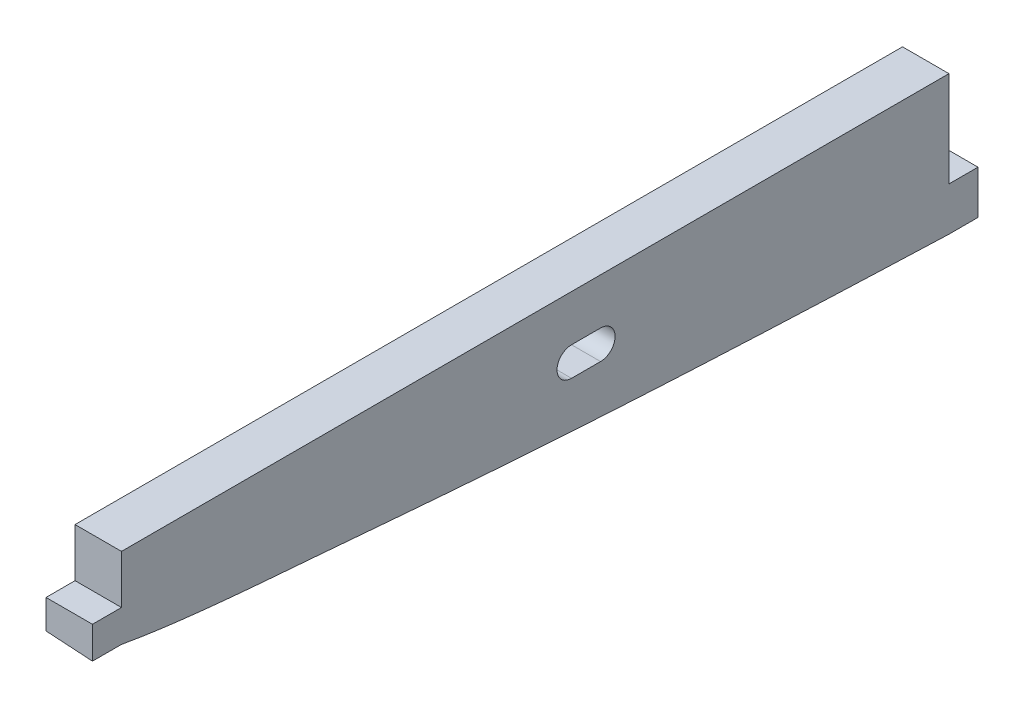
ISO-10303-21;
HEADER;
FILE_DESCRIPTION(('STEP AP214'),'2;1');
FILE_NAME('part.step','',(''),(''),'','','');
FILE_SCHEMA(('AUTOMOTIVE_DESIGN { 1 0 10303 214 1 1 1 1 }'));
ENDSEC;
DATA;
#1=APPLICATION_CONTEXT('core data for automotive mechanical design processes');
#2=APPLICATION_PROTOCOL_DEFINITION('international standard','automotive_design',2000,#1);
#3=PRODUCT_CONTEXT('',#1,'mechanical');
#4=PRODUCT('Part','Part','',(#3));
#5=PRODUCT_RELATED_PRODUCT_CATEGORY('part','',(#4));
#6=PRODUCT_DEFINITION_FORMATION('','',#4);
#7=PRODUCT_DEFINITION_CONTEXT('part definition',#1,'design');
#8=PRODUCT_DEFINITION('design','',#6,#7);
#9=PRODUCT_DEFINITION_SHAPE('','',#8);
#10=(LENGTH_UNIT() NAMED_UNIT(*) SI_UNIT(.MILLI.,.METRE.));
#11=(NAMED_UNIT(*) PLANE_ANGLE_UNIT() SI_UNIT($,.RADIAN.));
#12=(NAMED_UNIT(*) SI_UNIT($,.STERADIAN.) SOLID_ANGLE_UNIT());
#13=UNCERTAINTY_MEASURE_WITH_UNIT(LENGTH_MEASURE(1.E-05),#10,'distance_accuracy_value','');
#14=(GEOMETRIC_REPRESENTATION_CONTEXT(3) GLOBAL_UNCERTAINTY_ASSIGNED_CONTEXT((#13)) GLOBAL_UNIT_ASSIGNED_CONTEXT((#10,
#11,#12)) REPRESENTATION_CONTEXT('',''));
#15=CARTESIAN_POINT('',(0.,0.,0.));
#16=DIRECTION('',(0.,0.,1.));
#17=DIRECTION('',(1.,0.,0.));
#18=AXIS2_PLACEMENT_3D('',#15,#16,#17);
#19=CARTESIAN_POINT('',(0.,0.,12.7));
#20=DIRECTION('',(0.,1.,0.));
#21=DIRECTION('',(0.,0.,-1.));
#22=AXIS2_PLACEMENT_3D('',#19,#20,#21);
#23=PLANE('',#22);
#24=DIRECTION('',(0.,0.,1.));
#25=VECTOR('',#24,1.);
#26=CARTESIAN_POINT('',(5.08000000000002,0.,12.7));
#27=LINE('',#26,#25);
#28=CARTESIAN_POINT('',(5.08000000000002,0.,12.7));
#29=VERTEX_POINT('',#28);
#30=CARTESIAN_POINT('',(5.08000000000002,0.,193.675));
#31=VERTEX_POINT('',#30);
#32=EDGE_CURVE('E344',#29,#31,#27,.T.);
#33=ORIENTED_EDGE('',*,*,#32,.F.);
#34=DIRECTION('',(1.,0.,0.));
#35=VECTOR('',#34,1.);
#36=CARTESIAN_POINT('',(-5.07999999999998,0.,12.7));
#37=LINE('',#36,#35);
#38=CARTESIAN_POINT('',(-5.07999999999998,0.,12.7));
#39=VERTEX_POINT('',#38);
#40=EDGE_CURVE('E272',#39,#29,#37,.T.);
#41=ORIENTED_EDGE('',*,*,#40,.F.);
#42=DIRECTION('',(0.,0.,-1.));
#43=VECTOR('',#42,1.);
#44=CARTESIAN_POINT('',(-5.07999999999998,0.,193.675));
#45=LINE('',#44,#43);
#46=CARTESIAN_POINT('',(-5.07999999999998,0.,193.675));
#47=VERTEX_POINT('',#46);
#48=EDGE_CURVE('E351',#47,#39,#45,.T.);
#49=ORIENTED_EDGE('',*,*,#48,.F.);
#50=DIRECTION('',(-1.,0.,0.));
#51=VECTOR('',#50,1.);
#52=CARTESIAN_POINT('',(5.08000000000002,0.,193.675));
#53=LINE('',#52,#51);
#54=EDGE_CURVE('E347',#31,#47,#53,.T.);
#55=ORIENTED_EDGE('',*,*,#54,.F.);
#56=EDGE_LOOP('',(#33,#41,#49,#55));
#57=FACE_BOUND('',#56,.T.);
#58=ADVANCED_FACE('F36',(#57),#23,.T.);
#59=CARTESIAN_POINT('',(5.08000000000002,-42.6415296686,193.675));
#60=DIRECTION('',(0.,0.,1.));
#61=DIRECTION('',(-1.,0.,0.));
#62=AXIS2_PLACEMENT_3D('',#59,#60,#61);
#63=PLANE('',#62);
#64=DIRECTION('',(1.,0.,0.));
#65=VECTOR('',#64,1.);
#66=CARTESIAN_POINT('',(-5.08000000000006,-10.6301369254604,193.675));
#67=LINE('',#66,#65);
#68=CARTESIAN_POINT('',(-5.07999999999998,-10.6301369254604,193.675));
#69=VERTEX_POINT('',#68);
#70=CARTESIAN_POINT('',(5.08000000001965,-10.6301369254605,193.675));
#71=VERTEX_POINT('',#70);
#72=EDGE_CURVE('E312',#69,#71,#67,.T.);
#73=ORIENTED_EDGE('',*,*,#72,.T.);
#74=DIRECTION('',(0.,1.,0.));
#75=VECTOR('',#74,1.);
#76=CARTESIAN_POINT('',(5.08000000000002,-42.6415296686,193.675));
#77=LINE('',#76,#75);
#78=EDGE_CURVE('E269',#71,#31,#77,.T.);
#79=ORIENTED_EDGE('',*,*,#78,.T.);
#80=ORIENTED_EDGE('',*,*,#54,.T.);
#81=DIRECTION('',(0.,1.,0.));
#82=VECTOR('',#81,1.);
#83=CARTESIAN_POINT('',(-5.07999999999998,-42.6415296686,193.675));
#84=LINE('',#83,#82);
#85=EDGE_CURVE('E271',#69,#47,#84,.T.);
#86=ORIENTED_EDGE('',*,*,#85,.F.);
#87=EDGE_LOOP('',(#73,#79,#80,#86));
#88=FACE_BOUND('',#87,.T.);
#89=ADVANCED_FACE('F252',(#88),#63,.T.);
#90=CARTESIAN_POINT('',(-5.07999999999998,-42.6415296686,193.675));
#91=DIRECTION('',(-1.,0.,0.));
#92=DIRECTION('',(0.,0.,-1.));
#93=AXIS2_PLACEMENT_3D('',#90,#91,#92);
#94=PLANE('',#93);
#95=CARTESIAN_POINT('',(-5.07999999999998,-13.2559464874616,95.25));
#96=DIRECTION('',(1.,0.,0.));
#97=DIRECTION('',(0.,0.,-1.));
#98=AXIS2_PLACEMENT_3D('',#95,#96,#97);
#99=CIRCLE('',#98,3.175);
#100=CARTESIAN_POINT('',(-5.07999999999998,-16.4309464874616,95.25));
#101=VERTEX_POINT('',#100);
#102=CARTESIAN_POINT('',(-5.07999999999998,-10.0809464874616,95.25));
#103=VERTEX_POINT('',#102);
#104=EDGE_CURVE('E153',#101,#103,#99,.F.);
#105=ORIENTED_EDGE('',*,*,#104,.F.);
#106=DIRECTION('',(0.,0.,1.));
#107=VECTOR('',#106,1.);
#108=CARTESIAN_POINT('',(-5.07999999999998,-16.4309464874616,95.25));
#109=LINE('',#108,#107);
#110=CARTESIAN_POINT('',(-5.07999999999998,-16.4309464874615,88.9));
#111=VERTEX_POINT('',#110);
#112=EDGE_CURVE('E161',#111,#101,#109,.T.);
#113=ORIENTED_EDGE('',*,*,#112,.F.);
#114=CARTESIAN_POINT('',(-5.07999999999998,-13.2559464874616,88.9));
#115=DIRECTION('',(1.,0.,0.));
#116=DIRECTION('',(0.,0.,-1.));
#117=AXIS2_PLACEMENT_3D('',#114,#115,#116);
#118=CIRCLE('',#117,3.17499999999999);
#119=CARTESIAN_POINT('',(-5.07999999999998,-10.0809464874616,88.9));
#120=VERTEX_POINT('',#119);
#121=EDGE_CURVE('E154',#120,#111,#118,.F.);
#122=ORIENTED_EDGE('',*,*,#121,.F.);
#123=DIRECTION('',(0.,0.,-1.));
#124=VECTOR('',#123,1.);
#125=CARTESIAN_POINT('',(-5.07999999999998,-10.0809464874616,95.25));
#126=LINE('',#125,#124);
#127=EDGE_CURVE('E141',#103,#120,#126,.T.);
#128=ORIENTED_EDGE('',*,*,#127,.F.);
#129=EDGE_LOOP('',(#105,#113,#122,#128));
#130=FACE_BOUND('',#129,.T.);
#131=ORIENTED_EDGE('',*,*,#85,.T.);
#132=ORIENTED_EDGE('',*,*,#48,.T.);
#133=DIRECTION('',(0.,1.,0.));
#134=VECTOR('',#133,1.);
#135=CARTESIAN_POINT('',(-5.07999999999998,-42.6415296686,12.7));
#136=LINE('',#135,#134);
#137=CARTESIAN_POINT('',(-5.07999999999998,-20.8886194640954,12.7));
#138=VERTEX_POINT('',#137);
#139=EDGE_CURVE('E274',#138,#39,#136,.T.);
#140=ORIENTED_EDGE('',*,*,#139,.F.);
#141=DIRECTION('',(0.,0.,1.));
#142=VECTOR('',#141,1.);
#143=CARTESIAN_POINT('',(-5.07999999999998,-20.8886194640954,-8.45767184223761));
#144=LINE('',#143,#142);
#145=CARTESIAN_POINT('',(-5.07999999999998,-20.8886194640954,6.35));
#146=VERTEX_POINT('',#145);
#147=EDGE_CURVE('E289',#146,#138,#144,.T.);
#148=ORIENTED_EDGE('',*,*,#147,.F.);
#149=DIRECTION('',(0.,1.,0.));
#150=VECTOR('',#149,1.);
#151=CARTESIAN_POINT('',(-5.07999999999998,-20.8886194640954,6.35));
#152=LINE('',#151,#150);
#153=CARTESIAN_POINT('',(-5.07999999999998,-31.6608776018952,6.35));
#154=VERTEX_POINT('',#153);
#155=EDGE_CURVE('E180',#154,#146,#152,.T.);
#156=ORIENTED_EDGE('',*,*,#155,.F.);
#157=DIRECTION('',(0.,0.,1.));
#158=VECTOR('',#157,1.);
#159=CARTESIAN_POINT('',(-5.07999999999998,-31.6608776018952,-8.45767184223761));
#160=LINE('',#159,#158);
#161=CARTESIAN_POINT('',(-5.07999999999998,-31.6608776018952,12.7));
#162=VERTEX_POINT('',#161);
#163=EDGE_CURVE('E293',#154,#162,#160,.T.);
#164=ORIENTED_EDGE('',*,*,#163,.T.);
#165=CARTESIAN_POINT('',(-5.07999999999997,-16.980136925459,193.675));
#166=CARTESIAN_POINT('',(-5.07999999999998,-17.0756432841999,193.279641324373));
#167=CARTESIAN_POINT('',(-5.07999999999998,-17.1693085813412,192.883838602711));
#168=CARTESIAN_POINT('',(-5.07999999999998,-17.3530020275571,192.091392551927));
#169=CARTESIAN_POINT('',(-5.07999999999998,-17.4430301991864,191.694749228034));
#170=CARTESIAN_POINT('',(-5.07999999999998,-17.6194886808394,190.900695476805));
#171=CARTESIAN_POINT('',(-5.07999999999998,-17.7059192705462,190.503285111624));
#172=CARTESIAN_POINT('',(-5.07999999999998,-17.8752415454966,189.70771194313));
#173=CARTESIAN_POINT('',(-5.07999999999998,-17.9581332266649,189.309549138952));
#174=CARTESIAN_POINT('',(-5.07999999999998,-18.2014330247857,188.115812018219));
#175=CARTESIAN_POINT('',(-5.07999999999998,-18.3568577975812,187.319218300621));
#176=CARTESIAN_POINT('',(-5.07999999999998,-18.6558636111726,185.723805757226));
#177=CARTESIAN_POINT('',(-5.07999999999998,-18.7994443943849,184.924986883426));
#178=CARTESIAN_POINT('',(-5.07999999999998,-19.0759438392213,183.326404337825));
#179=CARTESIAN_POINT('',(-5.07999999999998,-19.208873921586,182.52664263705));
#180=CARTESIAN_POINT('',(-5.07999999999998,-19.4654406759777,180.925641403551));
#181=CARTESIAN_POINT('',(-5.07999999999998,-19.589077403171,180.124401879627));
#182=CARTESIAN_POINT('',(-5.07999999999998,-19.9476034577443,177.719551036883));
#183=CARTESIAN_POINT('',(-5.07999999999998,-20.1702276596377,176.114107508349));
#184=CARTESIAN_POINT('',(-5.07999999999998,-20.5900673405072,172.900116650782));
#185=CARTESIAN_POINT('',(-5.07999999999998,-20.7872853451357,171.291569646429));
#186=CARTESIAN_POINT('',(-5.07999999999998,-21.1620701204436,168.072124506418));
#187=CARTESIAN_POINT('',(-5.07999999999998,-21.3396359295028,166.461226259614));
#188=CARTESIAN_POINT('',(-5.07999999999998,-21.6794854929014,163.238776895735));
#189=CARTESIAN_POINT('',(-5.07999999999998,-21.8417780619349,161.627226701043));
#190=CARTESIAN_POINT('',(-5.07999999999998,-22.0764358088338,159.208865693673));
#191=CARTESIAN_POINT('',(-5.07999999999998,-22.1532000960466,158.402477343453));
#192=CARTESIAN_POINT('',(-5.07999999999998,-22.3041398392182,156.789458347721));
#193=CARTESIAN_POINT('',(-5.07999999999998,-22.3783152959955,155.982827702285));
#194=CARTESIAN_POINT('',(-5.07999999999998,-22.5244030857482,154.369193789618));
#195=CARTESIAN_POINT('',(-5.07999999999998,-22.5963149476835,153.562190479828));
#196=CARTESIAN_POINT('',(-5.07999999999998,-22.7381464018302,151.948008974779));
#197=CARTESIAN_POINT('',(-5.07999999999998,-22.8080659935863,151.140830779478));
#198=CARTESIAN_POINT('',(-5.07999999999998,-22.9466155112933,149.526244722052));
#199=CARTESIAN_POINT('',(-5.07999999999998,-23.0152452463667,148.718836843605));
#200=CARTESIAN_POINT('',(-5.07999999999998,-23.151750342573,147.103957471898));
#201=CARTESIAN_POINT('',(-5.07999999999998,-23.2196257037258,146.296485978638));
#202=CARTESIAN_POINT('',(-5.07999999999998,-23.3550678473177,144.681465051655));
#203=CARTESIAN_POINT('',(-5.07999999999998,-23.4226346097008,143.873915616253));
#204=CARTESIAN_POINT('',(-5.07999999999998,-23.5577979145751,142.258819307691));
#205=CARTESIAN_POINT('',(-5.07999999999998,-23.6253944570635,141.451272434532));
#206=CARTESIAN_POINT('',(-5.07999999999998,-23.7608885714423,139.836221314754));
#207=CARTESIAN_POINT('',(-5.07999999999999,-23.8287861368574,139.028717067593));
#208=CARTESIAN_POINT('',(-5.07999999999998,-23.9650469993956,137.413747846051));
#209=CARTESIAN_POINT('',(-5.07999999999996,-24.0334102965385,136.606282871673));
#210=CARTESIAN_POINT('',(-5.07999999999995,-24.2104094955639,134.518940509737));
#211=CARTESIAN_POINT('',(-5.07999999999997,-24.319205863186,133.239076745608));
#212=CARTESIAN_POINT('',(-5.07999999999999,-24.5365927351079,130.679331771097));
#213=CARTESIAN_POINT('',(-5.07999999999998,-24.645183239404,129.399450560714));
#214=CARTESIAN_POINT('',(-5.07999999999998,-24.9696766478191,125.560019069695));
#215=CARTESIAN_POINT('',(-5.07999999999998,-25.1843287875946,123.000362386711));
#216=CARTESIAN_POINT('',(-5.07999999999998,-25.6068418525892,117.880670391001));
#217=CARTESIAN_POINT('',(-5.07999999999998,-25.8147032621842,115.320635118422));
#218=CARTESIAN_POINT('',(-5.07999999999998,-26.2216446216809,110.199891995452));
#219=CARTESIAN_POINT('',(-5.07999999999998,-26.420724663544,107.639184152389));
#220=CARTESIAN_POINT('',(-5.07999999999998,-26.8090574176331,102.516393462246));
#221=CARTESIAN_POINT('',(-5.07999999999998,-26.9983077178674,99.9543104320919));
#222=CARTESIAN_POINT('',(-5.07999999999998,-27.3664831960342,94.8292800923983));
#223=CARTESIAN_POINT('',(-5.07999999999999,-27.5454078834583,92.2663327476081));
#224=CARTESIAN_POINT('',(-5.07999999999997,-27.8929011409521,87.1396729527292));
#225=CARTESIAN_POINT('',(-5.07999999999996,-28.0614694561491,84.5759604853696));
#226=CARTESIAN_POINT('',(-5.08,-28.3885126736673,79.4478890788395));
#227=CARTESIAN_POINT('',(-5.08000000000006,-28.5469875632486,76.8835301388569));
#228=CARTESIAN_POINT('',(-5.08000000000006,-28.8543839446516,71.7525143894621));
#229=CARTESIAN_POINT('',(-5.08,-29.0032989581331,69.1858571923681));
#230=CARTESIAN_POINT('',(-5.07999999999996,-29.2920784438324,64.0520724929954));
#231=CARTESIAN_POINT('',(-5.07999999999997,-29.4319430491782,61.4849449981918));
#232=CARTESIAN_POINT('',(-5.07999999999998,-29.7034974721747,56.3502743410809));
#233=CARTESIAN_POINT('',(-5.07999999999998,-29.8351873397007,53.7827311814055));
#234=CARTESIAN_POINT('',(-5.07999999999998,-30.0912535213796,48.6472826502346));
#235=CARTESIAN_POINT('',(-5.07999999999998,-30.2156298402283,46.0793772789727));
#236=CARTESIAN_POINT('',(-5.07999999999998,-30.4578826901643,40.9441948350664));
#237=CARTESIAN_POINT('',(-5.07999999999998,-30.5757615640939,38.3769178726829));
#238=CARTESIAN_POINT('',(-5.07999999999998,-30.8058934885533,33.2421051413394));
#239=CARTESIAN_POINT('',(-5.07999999999998,-30.9181465232957,30.6745693716734));
#240=CARTESIAN_POINT('',(-5.07999999999998,-31.1378156049216,25.5392878959896));
#241=CARTESIAN_POINT('',(-5.07999999999998,-31.2452316449257,22.9715421896785));
#242=CARTESIAN_POINT('',(-5.07999999999998,-31.4559544814913,17.8358862061857));
#243=CARTESIAN_POINT('',(-5.07999999999997,-31.5592612848125,15.2679759292818));
#244=CARTESIAN_POINT('',(-5.07999999999997,-31.6608776018952,12.7));
#245=B_SPLINE_CURVE_WITH_KNOTS('',3,(#165,#166,#167,#168,#169,#170,#171,#172,#173,#174,#175,
#176,#177,#178,#179,#180,#181,#182,#183,#184,#185,#186,#187,#188,#189,#190,#191,#192,#193,#194,
#195,#196,#197,#198,#199,#200,#201,#202,#203,#204,#205,#206,#207,#208,#209,#210,#211,#212,#213,
#214,#215,#216,#217,#218,#219,#220,#221,#222,#223,#224,#225,#226,#227,#228,#229,#230,#231,#232,
#233,#234,#235,#236,#237,#238,#239,#240,#241,#242,#243,#244),.UNSPECIFIED.,.F.,.F.,(4,2,2,2,2,2,
2,2,2,2,2,2,2,2,2,2,2,2,2,2,2,2,2,2,2,2,2,2,2,2,2,2,2,2,2,2,2,2,2,4),(0.,1.22018694247771,
2.44036631710815,3.66045065476075,4.88053639743518,7.31526797891859,9.75005249711785,
12.1821902481035,14.6143135605178,19.4764306817586,24.3380640820521,29.1999352664489,
34.0589830711703,36.4890816304299,38.9191794213091,41.3497796016219,43.7803803373277,
46.2113379737972,48.6422955460615,51.0734089221001,53.5045220747313,55.9355831846378,
58.3666443981318,62.2200832218083,66.073522111523,73.7794407503376,81.4848085282798,
89.1900955938608,96.8972645125357,104.604799251938,112.312523599625,120.020257675914,
127.73316100456,135.445950853657,143.158693641286,150.871431476734,158.581369819146,
166.291329796186,174.00130073802,181.711258996097),.UNSPECIFIED.);
#246=CARTESIAN_POINT('',(-5.07999999999998,-16.980136925459,193.675));
#247=VERTEX_POINT('',#246);
#248=EDGE_CURVE('E227',#247,#162,#245,.T.);
#249=ORIENTED_EDGE('',*,*,#248,.F.);
#250=DIRECTION('',(0.,0.,-1.));
#251=VECTOR('',#250,1.);
#252=CARTESIAN_POINT('',(-5.08000000000011,-16.9801369254604,212.360092337899));
#253=LINE('',#252,#251);
#254=CARTESIAN_POINT('',(-5.08000000000011,-16.9801369254604,200.025));
#255=VERTEX_POINT('',#254);
#256=EDGE_CURVE('E316',#255,#247,#253,.T.);
#257=ORIENTED_EDGE('',*,*,#256,.F.);
#258=DIRECTION('',(0.,1.,0.));
#259=VECTOR('',#258,1.);
#260=CARTESIAN_POINT('',(-5.08000000000011,-16.9801369254604,200.025));
#261=LINE('',#260,#259);
#262=CARTESIAN_POINT('',(-5.08000000000006,-10.6301369254604,200.025));
#263=VERTEX_POINT('',#262);
#264=EDGE_CURVE('E331',#255,#263,#261,.T.);
#265=ORIENTED_EDGE('',*,*,#264,.T.);
#266=DIRECTION('',(0.,0.,-1.));
#267=VECTOR('',#266,1.);
#268=CARTESIAN_POINT('',(-5.08000000000006,-10.6301369254604,212.360092337899));
#269=LINE('',#268,#267);
#270=EDGE_CURVE('E314',#263,#69,#269,.T.);
#271=ORIENTED_EDGE('',*,*,#270,.T.);
#272=EDGE_LOOP('',(#131,#132,#140,#148,#156,#164,#249,#257,#265,#271));
#273=FACE_BOUND('',#272,.T.);
#274=ADVANCED_FACE('F150',(#130,#273),#94,.T.);
#275=CARTESIAN_POINT('',(-5.07999999999998,-42.6415296686,12.7));
#276=DIRECTION('',(0.,0.,-1.));
#277=DIRECTION('',(1.,0.,0.));
#278=AXIS2_PLACEMENT_3D('',#275,#276,#277);
#279=PLANE('',#278);
#280=DIRECTION('',(-1.,0.,0.));
#281=VECTOR('',#280,1.);
#282=CARTESIAN_POINT('',(5.08000000000001,-20.8886194640954,12.7));
#283=LINE('',#282,#281);
#284=CARTESIAN_POINT('',(5.08000000000002,-20.8886194640954,12.7));
#285=VERTEX_POINT('',#284);
#286=EDGE_CURVE('E155',#285,#138,#283,.T.);
#287=ORIENTED_EDGE('',*,*,#286,.T.);
#288=ORIENTED_EDGE('',*,*,#139,.T.);
#289=ORIENTED_EDGE('',*,*,#40,.T.);
#290=DIRECTION('',(0.,1.,0.));
#291=VECTOR('',#290,1.);
#292=CARTESIAN_POINT('',(5.08000000000002,-42.6415296686,12.7));
#293=LINE('',#292,#291);
#294=EDGE_CURVE('E46',#285,#29,#293,.T.);
#295=ORIENTED_EDGE('',*,*,#294,.F.);
#296=EDGE_LOOP('',(#287,#288,#289,#295));
#297=FACE_BOUND('',#296,.T.);
#298=ADVANCED_FACE('F251',(#297),#279,.T.);
#299=CARTESIAN_POINT('',(5.08000000000002,-42.6415296686,12.7));
#300=DIRECTION('',(1.,0.,0.));
#301=DIRECTION('',(0.,0.,1.));
#302=AXIS2_PLACEMENT_3D('',#299,#300,#301);
#303=PLANE('',#302);
#304=CARTESIAN_POINT('',(5.08000000000002,-13.2559464874616,95.25));
#305=DIRECTION('',(-1.,0.,0.));
#306=DIRECTION('',(0.,0.,1.));
#307=AXIS2_PLACEMENT_3D('',#304,#305,#306);
#308=CIRCLE('',#307,3.175);
#309=CARTESIAN_POINT('',(5.08000000000002,-16.4309464874616,95.25));
#310=VERTEX_POINT('',#309);
#311=CARTESIAN_POINT('',(5.08000000000002,-10.0809464874616,95.25));
#312=VERTEX_POINT('',#311);
#313=EDGE_CURVE('E160',#310,#312,#308,.T.);
#314=ORIENTED_EDGE('',*,*,#313,.T.);
#315=DIRECTION('',(0.,0.,-1.));
#316=VECTOR('',#315,1.);
#317=CARTESIAN_POINT('',(5.08000000000002,-10.0809464874616,95.25));
#318=LINE('',#317,#316);
#319=CARTESIAN_POINT('',(5.08000000000002,-10.0809464874616,88.9));
#320=VERTEX_POINT('',#319);
#321=EDGE_CURVE('E144',#312,#320,#318,.T.);
#322=ORIENTED_EDGE('',*,*,#321,.T.);
#323=CARTESIAN_POINT('',(5.08000000000002,-13.2559464874616,88.9));
#324=DIRECTION('',(-1.,0.,0.));
#325=DIRECTION('',(0.,0.,1.));
#326=AXIS2_PLACEMENT_3D('',#323,#324,#325);
#327=CIRCLE('',#326,3.17499999999999);
#328=CARTESIAN_POINT('',(5.08000000000002,-16.4309464874615,88.9));
#329=VERTEX_POINT('',#328);
#330=EDGE_CURVE('E168',#320,#329,#327,.T.);
#331=ORIENTED_EDGE('',*,*,#330,.T.);
#332=DIRECTION('',(0.,0.,1.));
#333=VECTOR('',#332,1.);
#334=CARTESIAN_POINT('',(5.08000000000002,-16.4309464874616,95.25));
#335=LINE('',#334,#333);
#336=EDGE_CURVE('E146',#329,#310,#335,.T.);
#337=ORIENTED_EDGE('',*,*,#336,.T.);
#338=EDGE_LOOP('',(#314,#322,#331,#337));
#339=FACE_BOUND('',#338,.T.);
#340=ORIENTED_EDGE('',*,*,#294,.T.);
#341=ORIENTED_EDGE('',*,*,#32,.T.);
#342=ORIENTED_EDGE('',*,*,#78,.F.);
#343=DIRECTION('',(0.,0.,-1.));
#344=VECTOR('',#343,1.);
#345=CARTESIAN_POINT('',(5.08000000001965,-10.6301369254605,212.360092337899));
#346=LINE('',#345,#344);
#347=CARTESIAN_POINT('',(5.08000000001965,-10.6301369254605,200.025));
#348=VERTEX_POINT('',#347);
#349=EDGE_CURVE('E275',#348,#71,#346,.T.);
#350=ORIENTED_EDGE('',*,*,#349,.F.);
#351=DIRECTION('',(1.84621829690683E-12,-1.,0.));
#352=VECTOR('',#351,1.);
#353=CARTESIAN_POINT('',(5.08000000001965,-10.6301369254605,200.025));
#354=LINE('',#353,#352);
#355=CARTESIAN_POINT('',(5.08000000003256,-17.625056723702,200.025));
#356=VERTEX_POINT('',#355);
#357=EDGE_CURVE('E325',#348,#356,#354,.T.);
#358=ORIENTED_EDGE('',*,*,#357,.T.);
#359=DIRECTION('',(0.,0.,-1.));
#360=VECTOR('',#359,1.);
#361=CARTESIAN_POINT('',(5.08000000003256,-17.625056723702,212.360092337899));
#362=LINE('',#361,#360);
#363=CARTESIAN_POINT('',(5.08000000003256,-17.625056723702,193.675));
#364=VERTEX_POINT('',#363);
#365=EDGE_CURVE('E187',#356,#364,#362,.T.);
#366=ORIENTED_EDGE('',*,*,#365,.T.);
#367=CARTESIAN_POINT('',(5.08000000000001,-30.4136194640954,12.7));
#368=CARTESIAN_POINT('',(5.08000000000002,-30.3607103436633,14.1380393395333));
#369=CARTESIAN_POINT('',(5.08000000000002,-30.3073974421912,15.5760638092187));
#370=CARTESIAN_POINT('',(5.08000000000002,-30.1998879656296,18.4520798784456));
#371=CARTESIAN_POINT('',(5.08000000000002,-30.1456913904354,19.8900714779833));
#372=CARTESIAN_POINT('',(5.08000000000002,-29.9816607154129,24.2040257032686));
#373=CARTESIAN_POINT('',(5.08000000000002,-29.8703869112998,27.0799338152813));
#374=CARTESIAN_POINT('',(5.08000000000002,-29.643153880169,32.8315800473151));
#375=CARTESIAN_POINT('',(5.08000000000002,-29.5271946293481,35.7073181663982));
#376=CARTESIAN_POINT('',(5.08000000000002,-29.2894321698031,41.4585535165029));
#377=CARTESIAN_POINT('',(5.08000000000002,-29.1676289613124,44.334050747534));
#378=CARTESIAN_POINT('',(5.08000000000002,-28.9169973843641,50.0850216649859));
#379=CARTESIAN_POINT('',(5.08000000000002,-28.7881683302458,52.9604953216201));
#380=CARTESIAN_POINT('',(5.08000000000002,-28.5222513377042,58.7110548423074));
#381=CARTESIAN_POINT('',(5.08000000000002,-28.3851634196582,61.5861407073));
#382=CARTESIAN_POINT('',(5.08000000000002,-28.1014312147161,67.3358458145818));
#383=CARTESIAN_POINT('',(5.08000000000003,-27.9547869162825,70.2104650563035));
#384=CARTESIAN_POINT('',(5.08000000000002,-27.6506446639058,75.9591578313104));
#385=CARTESIAN_POINT('',(5.08,-27.4931466082859,78.8332313592305));
#386=CARTESIAN_POINT('',(5.08,-27.1522154157379,84.8229853570577));
#387=CARTESIAN_POINT('',(5.08000000000002,-26.9677152185729,87.9386052912551));
#388=CARTESIAN_POINT('',(5.08000000000003,-26.5833815188076,94.1688790915734));
#389=CARTESIAN_POINT('',(5.08000000000002,-26.3835481211627,97.2835329641604));
#390=CARTESIAN_POINT('',(5.08000000000002,-25.968013076623,103.511688476695));
#391=CARTESIAN_POINT('',(5.08000000000002,-25.7523119057466,106.625190148393));
#392=CARTESIAN_POINT('',(5.08000000000002,-25.3051846626412,112.850872357938));
#393=CARTESIAN_POINT('',(5.08000000000002,-25.0737595538228,115.96305296499));
#394=CARTESIAN_POINT('',(5.08000000000002,-24.7158863962705,120.630523602852));
#395=CARTESIAN_POINT('',(5.08000000000002,-24.5948049605019,122.186227720433));
#396=CARTESIAN_POINT('',(5.08000000000002,-24.3494318736625,125.297382805915));
#397=CARTESIAN_POINT('',(5.08000000000002,-24.2251402227382,126.852833773828));
#398=CARTESIAN_POINT('',(5.08000000000002,-23.9738349400709,129.963600419338));
#399=CARTESIAN_POINT('',(5.08000000000003,-23.8468211608,131.518916084993));
#400=CARTESIAN_POINT('',(5.08000000000002,-23.5907791618374,134.629381404909));
#401=CARTESIAN_POINT('',(5.08,-23.4617509419614,136.184531059156));
#402=CARTESIAN_POINT('',(5.08,-23.2024882619735,139.296399789814));
#403=CARTESIAN_POINT('',(5.08000000000002,-23.0722526620826,140.853118770995));
#404=CARTESIAN_POINT('',(5.08000000000002,-22.8770602254366,143.188213447373));
#405=CARTESIAN_POINT('',(5.08000000000002,-22.8120227933639,143.966582403));
#406=CARTESIAN_POINT('',(5.08000000000002,-22.6822054359759,145.523341804854));
#407=CARTESIAN_POINT('',(5.08000000000002,-22.6174255106606,146.301732251081));
#408=CARTESIAN_POINT('',(5.08000000000002,-22.4883423312408,147.858535740854));
#409=CARTESIAN_POINT('',(5.08000000000002,-22.4240390668281,148.636948783544));
#410=CARTESIAN_POINT('',(5.08000000000002,-22.2961936786966,150.193837331513));
#411=CARTESIAN_POINT('',(5.08000000000002,-22.2326515549225,150.972312836788));
#412=CARTESIAN_POINT('',(5.08000000000002,-22.1061326809115,152.52927392166));
#413=CARTESIAN_POINT('',(5.08000000000002,-22.0431559049875,153.307759499173));
#414=CARTESIAN_POINT('',(5.08000000000002,-21.9174469869299,154.864750492744));
#415=CARTESIAN_POINT('',(5.08000000000002,-21.8547148448349,155.643255908805));
#416=CARTESIAN_POINT('',(5.08000000000002,-21.7290996088921,157.20019725001));
#417=CARTESIAN_POINT('',(5.08000000000002,-21.6662165264276,157.978633176071));
#418=CARTESIAN_POINT('',(5.08000000000002,-21.5397874952247,159.535451324608));
#419=CARTESIAN_POINT('',(5.08000000000002,-21.4762415464973,160.313833547085));
#420=CARTESIAN_POINT('',(5.08000000000002,-21.347847152608,161.870416149521));
#421=CARTESIAN_POINT('',(5.08000000000002,-21.2829988324972,162.648616539747));
#422=CARTESIAN_POINT('',(5.08000000000002,-21.1512518242833,164.204843945406));
#423=CARTESIAN_POINT('',(5.08000000000002,-21.0843531365969,164.982870960872));
#424=CARTESIAN_POINT('',(5.08000000000002,-20.9482146762939,166.538928192035));
#425=CARTESIAN_POINT('',(5.08000000000002,-20.8789742886037,167.316958354051));
#426=CARTESIAN_POINT('',(5.08000000000002,-20.7378146298909,168.872775395504));
#427=CARTESIAN_POINT('',(5.08000000000002,-20.665895358104,169.650562274872));
#428=CARTESIAN_POINT('',(5.08000000000003,-20.4455592276707,171.983396583078));
#429=CARTESIAN_POINT('',(5.08000000000004,-20.2925554972749,173.538016579228));
#430=CARTESIAN_POINT('',(5.08,-19.9704907744767,176.645591394602));
#431=CARTESIAN_POINT('',(5.07999999999994,-19.8014298953118,178.19854622549));
#432=CARTESIAN_POINT('',(5.08000000000011,-19.4422453062202,181.302258404441));
#433=CARTESIAN_POINT('',(5.08000000000034,-19.2521189133328,182.853015447055));
#434=CARTESIAN_POINT('',(5.07999999999986,-18.9462553908146,185.176767804522));
#435=CARTESIAN_POINT('',(5.07999999999956,-18.8408301211286,185.951122393865));
#436=CARTESIAN_POINT('',(5.08000000000048,-18.6221096928751,187.498713262901));
#437=CARTESIAN_POINT('',(5.0800000000017,-18.5088146354207,188.271949556831));
#438=CARTESIAN_POINT('',(5.07999999999834,-18.2731708809179,189.817816326486));
#439=CARTESIAN_POINT('',(5.07999999999376,-18.1508134996291,190.590445484929));
#440=CARTESIAN_POINT('',(5.08000000000628,-17.8958962557515,192.134052334315));
#441=CARTESIAN_POINT('',(5.08000000002339,-17.7633359268146,192.905029948113));
#442=CARTESIAN_POINT('',(5.08000000006509,-17.6250567237026,193.675));
#443=B_SPLINE_CURVE_WITH_KNOTS('',3,(#367,#368,#369,#370,#371,#372,#373,#374,#375,#376,#377,
#378,#379,#380,#381,#382,#383,#384,#385,#386,#387,#388,#389,#390,#391,#392,#393,#394,#395,#396,
#397,#398,#399,#400,#401,#402,#403,#404,#405,#406,#407,#408,#409,#410,#411,#412,#413,#414,#415,
#416,#417,#418,#419,#420,#421,#422,#423,#424,#425,#426,#427,#428,#429,#430,#431,#432,#433,#434,
#435,#436,#437,#438,#439,#440,#441,#442),.UNSPECIFIED.,.F.,.F.,(4,2,2,2,2,2,2,2,2,2,2,2,2,2,2,2,
2,2,2,2,2,2,2,2,2,2,2,2,2,2,2,2,2,2,2,2,2,4),(0.,4.31703691222627,8.63407433592854,
17.2682510729776,25.9024716792377,34.536691940514,43.1717563387558,51.8067994322281,
60.4418529510671,69.0769873731256,78.4401853752597,87.8033192922918,97.1661724384823,
106.528452436058,111.209676412762,115.890900175587,120.572378285761,125.253856824221,
129.94032857947,132.28357266191,134.626816744655,136.970010003471,139.31320309232,
141.656289172387,143.999375623261,146.342290596994,148.685205532057,151.027896570597,
153.370587133108,155.713897882687,158.057209300724,162.743534343582,167.429826340207,
172.116715883239,174.461177735905,176.805609471884,179.152317644566,181.49913314243),.UNSPECIFIED.);
#444=CARTESIAN_POINT('',(5.08000000000002,-30.4136194640954,12.7));
#445=VERTEX_POINT('',#444);
#446=EDGE_CURVE('E238',#445,#364,#443,.T.);
#447=ORIENTED_EDGE('',*,*,#446,.F.);
#448=DIRECTION('',(0.,0.,1.));
#449=VECTOR('',#448,1.);
#450=CARTESIAN_POINT('',(5.07999999999997,-30.4136194640954,-8.45767184223761));
#451=LINE('',#450,#449);
#452=CARTESIAN_POINT('',(5.07999999999997,-30.4136194640954,6.35));
#453=VERTEX_POINT('',#452);
#454=EDGE_CURVE('E296',#453,#445,#451,.T.);
#455=ORIENTED_EDGE('',*,*,#454,.F.);
#456=DIRECTION('',(0.,-1.,0.));
#457=VECTOR('',#456,1.);
#458=CARTESIAN_POINT('',(5.07999999999997,-30.4136194640954,6.35));
#459=LINE('',#458,#457);
#460=CARTESIAN_POINT('',(5.08000000000001,-20.8886194640954,6.35));
#461=VERTEX_POINT('',#460);
#462=EDGE_CURVE('E179',#461,#453,#459,.T.);
#463=ORIENTED_EDGE('',*,*,#462,.F.);
#464=DIRECTION('',(0.,0.,1.));
#465=VECTOR('',#464,1.);
#466=CARTESIAN_POINT('',(5.08,-20.8886194640954,-8.45767184223761));
#467=LINE('',#466,#465);
#468=EDGE_CURVE('E292',#461,#285,#467,.T.);
#469=ORIENTED_EDGE('',*,*,#468,.T.);
#470=EDGE_LOOP('',(#340,#341,#342,#350,#358,#366,#447,#455,#463,#469));
#471=FACE_BOUND('',#470,.T.);
#472=ADVANCED_FACE('F38',(#339,#471),#303,.T.);
#473=CARTESIAN_POINT('',(431.734840310151,21.7605937801039,12.7));
#474=CARTESIAN_POINT('',(354.767844288554,16.8338696421729,193.675));
#475=CARTESIAN_POINT('',(359.947038365062,12.3559912931068,12.7));
#476=CARTESIAN_POINT('',(310.097450923152,11.6348174747197,193.675));
#477=CARTESIAN_POINT('',(269.243100308333,4.47194242178666,12.7));
#478=CARTESIAN_POINT('',(262.811763272532,6.19328661899001,193.675));
#479=CARTESIAN_POINT('',(134.824681561379,-11.5965261113863,12.7));
#480=CARTESIAN_POINT('',(174.807204775536,-3.12370601781253,193.675));
#481=CARTESIAN_POINT('',(61.0079838057599,-23.2707663222177,12.7));
#482=CARTESIAN_POINT('',(125.885137964367,-8.40143482766446,193.675));
#483=CARTESIAN_POINT('',(-7.57448013019039,-32.0728085231161,12.7));
#484=CARTESIAN_POINT('',(95.2392830186844,-12.5543427594087,193.675));
#485=CARTESIAN_POINT('',(-56.6014415598715,-37.4273851616648,12.7));
#486=CARTESIAN_POINT('',(73.2328383306058,-14.545039815151,193.675));
#487=CARTESIAN_POINT('',(-101.554682383788,-40.6255245092423,12.7));
#488=CARTESIAN_POINT('',(53.19290947036,-15.6229185194115,193.675));
#489=CARTESIAN_POINT('',(-162.108512633066,-42.6405296686,12.7));
#490=CARTESIAN_POINT('',(26.4224711708667,-17.7841951964629,193.675));
#491=CARTESIAN_POINT('',(-219.674755662316,-42.1913696879014,12.7));
#492=CARTESIAN_POINT('',(1.20435486937876,-18.3278371209846,193.675));
#493=CARTESIAN_POINT('',(-277.387002198729,-37.6824386266616,12.7));
#494=CARTESIAN_POINT('',(-24.762319926496,-14.6646457914026,193.675));
#495=CARTESIAN_POINT('',(-316.91598283312,-32.429184881224,12.7));
#496=CARTESIAN_POINT('',(-42.8978776568357,-11.2117215138955,193.675));
#497=CARTESIAN_POINT('',(-335.873433041802,-29.2217461076087,12.7));
#498=CARTESIAN_POINT('',(-51.7668614896513,-9.28862358966858,193.675));
#499=CARTESIAN_POINT('',(-355.917706008495,-24.6769147105371,12.7));
#500=CARTESIAN_POINT('',(-61.3592087829487,-7.08085040375625,193.675));
#501=CARTESIAN_POINT('',(-376.479719065935,-18.4843074578187,12.7));
#502=CARTESIAN_POINT('',(-71.4229154101156,-4.47533013950984,193.675));
#503=CARTESIAN_POINT('',(-403.619324126275,-5.76674386113685,12.7));
#504=CARTESIAN_POINT('',(-84.7809802121899,2.46786226068882,193.675));
#505=CARTESIAN_POINT('',(-419.319297489577,5.54724659797443,12.7));
#506=CARTESIAN_POINT('',(-92.8925549799078,8.60514732719381,193.675));
#507=CARTESIAN_POINT('',(-426.587707478516,12.2355937801035,12.7));
#508=CARTESIAN_POINT('',(-96.6320286366427,12.2355937801034,193.675));
#509=B_SPLINE_SURFACE_WITH_KNOTS('',3,1,((#473,#474),(#475,#476),(#477,#478),(#479,#480),(#481,
#482),(#483,#484),(#485,#486),(#487,#488),(#489,#490),(#491,#492),(#493,#494),(#495,#496),(#497,
#498),(#499,#500),(#501,#502),(#503,#504),(#505,#506),(#507,#508)),.UNSPECIFIED.,.F.,.F.,.F.,(4,
1,1,1,1,1,1,1,1,1,1,1,1,1,1,4),(2,2),(0.,0.247403676163197,0.308401542794999,0.462108507234246,
0.504395117820794,0.542913331738732,0.627983171442133,0.653401948280027,0.743134379497065,
0.818760812058344,0.850169972641487,0.882434425471212,0.887176210845698,0.924179621726545,
0.960505119713505,1.),(0.,1.),.UNSPECIFIED.);
#510=CARTESIAN_POINT('',(5.08000000000003,-17.6250567237014,193.675));
#511=CARTESIAN_POINT('',(4.65604426083976,-17.6084136688874,193.675));
#512=CARTESIAN_POINT('',(4.23213671133665,-17.5905356848612,193.675));
#513=CARTESIAN_POINT('',(3.38448194754094,-17.5522689980007,193.675));
#514=CARTESIAN_POINT('',(2.96073472070473,-17.531880572917,193.675));
#515=CARTESIAN_POINT('',(2.11340264561636,-17.4885501104286,193.675));
#516=CARTESIAN_POINT('',(1.68981778755865,-17.4656082649375,193.675));
#517=CARTESIAN_POINT('',(0.842812448115538,-17.4171319014567,193.675));
#518=CARTESIAN_POINT('',(0.419391961113545,-17.3915974816673,193.675));
#519=CARTESIAN_POINT('',(-0.427281511848075,-17.3378839877552,193.675));
#520=CARTESIAN_POINT('',(-0.850534497723835,-17.30970491231,193.675));
#521=CARTESIAN_POINT('',(-1.69687264729717,-17.2507127904831,193.675));
#522=CARTESIAN_POINT('',(-2.11995780414094,-17.2198996458253,193.675));
#523=CARTESIAN_POINT('',(-2.96596574211308,-17.1557137528854,193.675));
#524=CARTESIAN_POINT('',(-3.38888850862457,-17.122340812141,193.675));
#525=CARTESIAN_POINT('',(-4.23457656645487,-17.0530964507859,193.675));
#526=CARTESIAN_POINT('',(-4.65734183520719,-17.0172247544861,193.675));
#527=CARTESIAN_POINT('',(-5.07999999999997,-16.980136925459,193.675));
#528=B_SPLINE_CURVE_WITH_KNOTS('',3,(#510,#511,#512,#513,#514,#515,#516,#517,#518,#519,#520,
#521,#522,#523,#524,#525,#526,#527),.UNSPECIFIED.,.F.,.F.,(4,2,2,2,2,2,2,2,4),(0.,
1.27284549321829,2.54555028752222,3.81815949055707,5.09072050827215,6.36328216235195,
7.63589131604013,8.90859624688347,10.1814418190823),.UNSPECIFIED.);
#529=EDGE_CURVE('E11',#364,#247,#528,.T.);
#530=CARTESIAN_POINT('',(-5.07999999999997,-31.6608776018952,12.7));
#531=CARTESIAN_POINT('',(-4.51538226191388,-31.5930016782029,12.7));
#532=CARTESIAN_POINT('',(-3.95079389377193,-31.524881508298,12.7));
#533=CARTESIAN_POINT('',(-2.82167608878542,-31.3881609554358,12.7));
#534=CARTESIAN_POINT('',(-2.25714665186112,-31.3195605731369,12.7));
#535=CARTESIAN_POINT('',(-1.12814572484586,-31.1818877340982,12.7));
#536=CARTESIAN_POINT('',(-0.563674234716949,-31.1128152776697,12.7));
#537=CARTESIAN_POINT('',(0.565211766645643,-30.9742064685929,12.7));
#538=CARTESIAN_POINT('',(1.12962627788113,-30.9046701159592,12.7));
#539=CARTESIAN_POINT('',(2.25839936344775,-30.765141707883,12.7));
#540=CARTESIAN_POINT('',(2.82275793773994,-30.6951496521256,12.7));
#541=CARTESIAN_POINT('',(3.95142017457908,-30.5547180695327,12.7));
#542=CARTESIAN_POINT('',(4.51572383705193,-30.4842785421017,12.7));
#543=CARTESIAN_POINT('',(5.08,-30.4136194640954,12.7));
#544=B_SPLINE_CURVE_WITH_KNOTS('',3,(#530,#531,#532,#533,#534,#535,#536,#537,#538,#539,#540,
#541,#542,#543),.UNSPECIFIED.,.F.,.F.,(4,2,2,2,2,2,4),(0.,1.7060488740941,3.41209540934869,
5.11814081972013,6.8241861758734,8.5302327111284,10.2362815174525),.UNSPECIFIED.);
#545=EDGE_CURVE('E239',#162,#445,#544,.T.);
#546=ORIENTED_EDGE('',*,*,#446,.T.);
#547=ORIENTED_EDGE('',*,*,#529,.T.);
#548=ORIENTED_EDGE('',*,*,#248,.T.);
#549=ORIENTED_EDGE('',*,*,#545,.T.);
#550=EDGE_LOOP('',(#546,#547,#548,#549));
#551=FACE_BOUND('',#550,.T.);
#552=ADVANCED_FACE('F218',(#551),#509,.F.);
#553=CARTESIAN_POINT('',(5.07999999999999,-17.6250567237024,212.360092337899));
#554=CARTESIAN_POINT('',(3.16960647029669,-17.5500615051181,212.360092337899));
#555=CARTESIAN_POINT('',(-0.217402690468663,-17.3725569451114,212.360092337899));
#556=CARTESIAN_POINT('',(-3.60353710007813,-17.1096927288531,212.360092337899));
#557=CARTESIAN_POINT('',(-5.08000000000011,-16.9801369254604,212.360092337899));
#558=B_SPLINE_CURVE_WITH_KNOTS('',3,(#553,#554,#555,#556,#557),.UNSPECIFIED.,.F.,.F.,(4,1,4),
(0.728676227971784,0.743134379497065,0.754318726339323),.UNSPECIFIED.);
#559=DIRECTION('',(0.,0.,-1.));
#560=VECTOR('',#559,1.);
#561=SURFACE_OF_LINEAR_EXTRUSION('',#558,#560);
#562=CARTESIAN_POINT('',(5.07999999999999,-17.6250567237024,200.025));
#563=CARTESIAN_POINT('',(3.16960647029669,-17.5500615051181,200.025));
#564=CARTESIAN_POINT('',(-0.217402690468664,-17.3725569451114,200.025));
#565=CARTESIAN_POINT('',(-3.60353710007813,-17.1096927288531,200.025));
#566=CARTESIAN_POINT('',(-5.08000000000011,-16.9801369254604,200.025));
#567=B_SPLINE_CURVE_WITH_KNOTS('',3,(#562,#563,#564,#565,#566),.UNSPECIFIED.,.F.,.F.,(4,1,4),
(0.728676227971784,0.743134379497065,0.754318726339323),.UNSPECIFIED.);
#568=EDGE_CURVE('E328',#356,#255,#567,.T.);
#569=ORIENTED_EDGE('',*,*,#568,.T.);
#570=ORIENTED_EDGE('',*,*,#256,.T.);
#571=ORIENTED_EDGE('',*,*,#529,.F.);
#572=ORIENTED_EDGE('',*,*,#365,.F.);
#573=EDGE_LOOP('',(#569,#570,#571,#572));
#574=FACE_BOUND('',#573,.T.);
#575=ADVANCED_FACE('F213',(#574),#561,.T.);
#576=CARTESIAN_POINT('',(-5.08000000000006,-10.6301369254604,212.360092337899));
#577=DIRECTION('',(0.,-1.,0.));
#578=DIRECTION('',(1.,0.,0.));
#579=AXIS2_PLACEMENT_3D('',#576,#577,#578);
#580=PLANE('',#579);
#581=DIRECTION('',(1.,0.,0.));
#582=VECTOR('',#581,1.);
#583=CARTESIAN_POINT('',(-5.08000000000006,-10.6301369254604,200.025));
#584=LINE('',#583,#582);
#585=EDGE_CURVE('E268',#263,#348,#584,.T.);
#586=ORIENTED_EDGE('',*,*,#585,.T.);
#587=ORIENTED_EDGE('',*,*,#349,.T.);
#588=ORIENTED_EDGE('',*,*,#72,.F.);
#589=ORIENTED_EDGE('',*,*,#270,.F.);
#590=EDGE_LOOP('',(#586,#587,#588,#589));
#591=FACE_BOUND('',#590,.T.);
#592=ADVANCED_FACE('F209',(#591),#580,.F.);
#593=CARTESIAN_POINT('',(128.771490598678,24.6260485708758,200.025));
#594=DIRECTION('',(0.,0.,1.));
#595=DIRECTION('',(1.,0.,0.));
#596=AXIS2_PLACEMENT_3D('',#593,#594,#595);
#597=PLANE('',#596);
#598=ORIENTED_EDGE('',*,*,#357,.F.);
#599=ORIENTED_EDGE('',*,*,#585,.F.);
#600=ORIENTED_EDGE('',*,*,#264,.F.);
#601=ORIENTED_EDGE('',*,*,#568,.F.);
#602=EDGE_LOOP('',(#598,#599,#600,#601));
#603=FACE_BOUND('',#602,.T.);
#604=ADVANCED_FACE('F212',(#603),#597,.T.);
#605=CARTESIAN_POINT('',(5.08,-20.8886194640954,-8.45767184223761));
#606=DIRECTION('',(0.,-1.,0.));
#607=DIRECTION('',(1.,0.,0.));
#608=AXIS2_PLACEMENT_3D('',#605,#606,#607);
#609=PLANE('',#608);
#610=ORIENTED_EDGE('',*,*,#147,.T.);
#611=ORIENTED_EDGE('',*,*,#286,.F.);
#612=ORIENTED_EDGE('',*,*,#468,.F.);
#613=DIRECTION('',(1.,0.,0.));
#614=VECTOR('',#613,1.);
#615=CARTESIAN_POINT('',(5.08,-20.8886194640954,6.35));
#616=LINE('',#615,#614);
#617=EDGE_CURVE('E177',#146,#461,#616,.T.);
#618=ORIENTED_EDGE('',*,*,#617,.F.);
#619=EDGE_LOOP('',(#610,#611,#612,#618));
#620=FACE_BOUND('',#619,.T.);
#621=ADVANCED_FACE('F206',(#620),#609,.F.);
#622=CARTESIAN_POINT('',(-5.08000000000005,-31.6608776018953,-8.45767184223761));
#623=CARTESIAN_POINT('',(-1.68849198647581,-31.2531650165357,-8.45767184223761));
#624=CARTESIAN_POINT('',(1.69802923014001,-30.8371123116489,-8.45767184223761));
#625=CARTESIAN_POINT('',(5.07999999999997,-30.4136194640954,-8.45767184223761));
#626=B_SPLINE_CURVE_WITH_KNOTS('',3,(#622,#623,#624,#625),.UNSPECIFIED.,.F.,.F.,(4,4),
(0.488693032888809,0.500238048959886),.UNSPECIFIED.);
#627=DIRECTION('',(0.,0.,1.));
#628=VECTOR('',#627,1.);
#629=SURFACE_OF_LINEAR_EXTRUSION('',#626,#628);
#630=ORIENTED_EDGE('',*,*,#454,.T.);
#631=ORIENTED_EDGE('',*,*,#545,.F.);
#632=ORIENTED_EDGE('',*,*,#163,.F.);
#633=CARTESIAN_POINT('',(-5.08000000000005,-31.6608776018953,6.35));
#634=CARTESIAN_POINT('',(-1.68849198647581,-31.2531650165357,6.35));
#635=CARTESIAN_POINT('',(1.69802923014002,-30.8371123116489,6.35));
#636=CARTESIAN_POINT('',(5.07999999999997,-30.4136194640954,6.35));
#637=B_SPLINE_CURVE_WITH_KNOTS('',3,(#633,#634,#635,#636),.UNSPECIFIED.,.F.,.F.,(4,4),
(0.488693032888809,0.500238048959886),.UNSPECIFIED.);
#638=EDGE_CURVE('E183',#453,#154,#637,.F.);
#639=ORIENTED_EDGE('',*,*,#638,.F.);
#640=EDGE_LOOP('',(#630,#631,#632,#639));
#641=FACE_BOUND('',#640,.T.);
#642=ADVANCED_FACE('F201',(#641),#629,.T.);
#643=CARTESIAN_POINT('',(0.610306340184302,38.7736380621064,6.35));
#644=DIRECTION('',(0.,0.,1.));
#645=DIRECTION('',(1.,0.,0.));
#646=AXIS2_PLACEMENT_3D('',#643,#644,#645);
#647=PLANE('',#646);
#648=ORIENTED_EDGE('',*,*,#462,.T.);
#649=ORIENTED_EDGE('',*,*,#638,.T.);
#650=ORIENTED_EDGE('',*,*,#155,.T.);
#651=ORIENTED_EDGE('',*,*,#617,.T.);
#652=EDGE_LOOP('',(#648,#649,#650,#651));
#653=FACE_BOUND('',#652,.T.);
#654=ADVANCED_FACE('F205',(#653),#647,.F.);
#655=CARTESIAN_POINT('',(-5.08105,-13.2559464874616,95.25));
#656=DIRECTION('',(1.,0.,0.));
#657=DIRECTION('',(0.,0.,1.));
#658=AXIS2_PLACEMENT_3D('',#655,#656,#657);
#659=CYLINDRICAL_SURFACE('',#658,3.175);
#660=DIRECTION('',(1.,0.,0.));
#661=VECTOR('',#660,1.);
#662=CARTESIAN_POINT('',(-5.08105,-16.4309464874616,95.25));
#663=LINE('',#662,#661);
#664=EDGE_CURVE('E156',#101,#310,#663,.T.);
#665=ORIENTED_EDGE('',*,*,#664,.F.);
#666=ORIENTED_EDGE('',*,*,#104,.T.);
#667=DIRECTION('',(1.,0.,0.));
#668=VECTOR('',#667,1.);
#669=CARTESIAN_POINT('',(-5.08105,-10.0809464874616,95.25));
#670=LINE('',#669,#668);
#671=EDGE_CURVE('E62',#103,#312,#670,.T.);
#672=ORIENTED_EDGE('',*,*,#671,.T.);
#673=ORIENTED_EDGE('',*,*,#313,.F.);
#674=EDGE_LOOP('',(#665,#666,#672,#673));
#675=FACE_BOUND('',#674,.T.);
#676=ADVANCED_FACE('F158',(#675),#659,.F.);
#677=CARTESIAN_POINT('',(-5.08105,-16.4309464874616,95.25));
#678=DIRECTION('',(0.,-1.,0.));
#679=DIRECTION('',(0.,0.,1.));
#680=AXIS2_PLACEMENT_3D('',#677,#678,#679);
#681=PLANE('',#680);
#682=DIRECTION('',(1.,0.,0.));
#683=VECTOR('',#682,1.);
#684=CARTESIAN_POINT('',(-5.08105,-16.4309464874615,88.9));
#685=LINE('',#684,#683);
#686=EDGE_CURVE('E174',#111,#329,#685,.T.);
#687=ORIENTED_EDGE('',*,*,#686,.F.);
#688=ORIENTED_EDGE('',*,*,#112,.T.);
#689=ORIENTED_EDGE('',*,*,#664,.T.);
#690=ORIENTED_EDGE('',*,*,#336,.F.);
#691=EDGE_LOOP('',(#687,#688,#689,#690));
#692=FACE_BOUND('',#691,.T.);
#693=ADVANCED_FACE('F454',(#692),#681,.F.);
#694=CARTESIAN_POINT('',(-5.08105,-13.2559464874616,88.9));
#695=DIRECTION('',(1.,0.,0.));
#696=DIRECTION('',(0.,0.,1.));
#697=AXIS2_PLACEMENT_3D('',#694,#695,#696);
#698=CYLINDRICAL_SURFACE('',#697,3.17499999999999);
#699=DIRECTION('',(1.,0.,0.));
#700=VECTOR('',#699,1.);
#701=CARTESIAN_POINT('',(-5.08105,-10.0809464874616,88.9));
#702=LINE('',#701,#700);
#703=EDGE_CURVE('E54',#120,#320,#702,.T.);
#704=ORIENTED_EDGE('',*,*,#703,.F.);
#705=ORIENTED_EDGE('',*,*,#121,.T.);
#706=ORIENTED_EDGE('',*,*,#686,.T.);
#707=ORIENTED_EDGE('',*,*,#330,.F.);
#708=EDGE_LOOP('',(#704,#705,#706,#707));
#709=FACE_BOUND('',#708,.T.);
#710=ADVANCED_FACE('F463',(#709),#698,.F.);
#711=CARTESIAN_POINT('',(-5.08105,-10.0809464874616,95.25));
#712=DIRECTION('',(0.,1.,0.));
#713=DIRECTION('',(0.,0.,-1.));
#714=AXIS2_PLACEMENT_3D('',#711,#712,#713);
#715=PLANE('',#714);
#716=ORIENTED_EDGE('',*,*,#671,.F.);
#717=ORIENTED_EDGE('',*,*,#127,.T.);
#718=ORIENTED_EDGE('',*,*,#703,.T.);
#719=ORIENTED_EDGE('',*,*,#321,.F.);
#720=EDGE_LOOP('',(#716,#717,#718,#719));
#721=FACE_BOUND('',#720,.T.);
#722=ADVANCED_FACE('F140',(#721),#715,.F.);
#723=CLOSED_SHELL('',(#58,#89,#274,#298,#472,#552,#575,#592,#604,#621,#642,#654,#676,#693,#710,#722));
#724=MANIFOLD_SOLID_BREP('B2',#723);
#725=ADVANCED_BREP_SHAPE_REPRESENTATION('',(#18,#724),#14);
#726=SHAPE_DEFINITION_REPRESENTATION(#9,#725);
ENDSEC;
END-ISO-10303-21;
